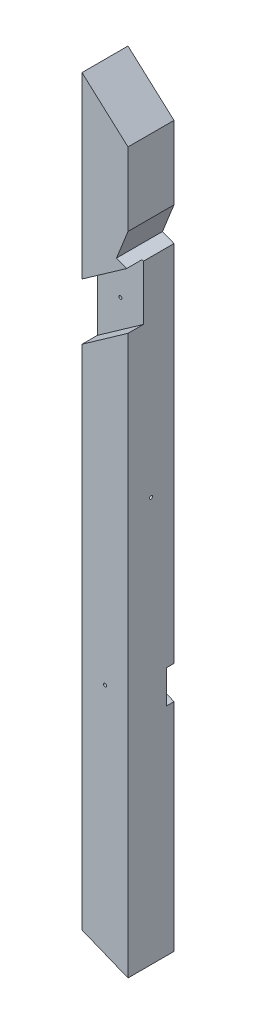
ISO-10303-21;
HEADER;
FILE_DESCRIPTION(('STEP AP214'),'2;1');
FILE_NAME('part.step','',(''),(''),'','','');
FILE_SCHEMA(('AUTOMOTIVE_DESIGN { 1 0 10303 214 1 1 1 1 }'));
ENDSEC;
DATA;
#1=APPLICATION_CONTEXT('core data for automotive mechanical design processes');
#2=APPLICATION_PROTOCOL_DEFINITION('international standard','automotive_design',2000,#1);
#3=PRODUCT_CONTEXT('',#1,'mechanical');
#4=PRODUCT('Part','Part','',(#3));
#5=PRODUCT_RELATED_PRODUCT_CATEGORY('part','',(#4));
#6=PRODUCT_DEFINITION_FORMATION('','',#4);
#7=PRODUCT_DEFINITION_CONTEXT('part definition',#1,'design');
#8=PRODUCT_DEFINITION('design','',#6,#7);
#9=PRODUCT_DEFINITION_SHAPE('','',#8);
#10=(LENGTH_UNIT() NAMED_UNIT(*) SI_UNIT(.MILLI.,.METRE.));
#11=(NAMED_UNIT(*) PLANE_ANGLE_UNIT() SI_UNIT($,.RADIAN.));
#12=(NAMED_UNIT(*) SI_UNIT($,.STERADIAN.) SOLID_ANGLE_UNIT());
#13=UNCERTAINTY_MEASURE_WITH_UNIT(LENGTH_MEASURE(1.E-05),#10,'distance_accuracy_value','');
#14=(GEOMETRIC_REPRESENTATION_CONTEXT(3) GLOBAL_UNCERTAINTY_ASSIGNED_CONTEXT((#13)) GLOBAL_UNIT_ASSIGNED_CONTEXT((#10,
#11,#12)) REPRESENTATION_CONTEXT('',''));
#15=CARTESIAN_POINT('',(0.,0.,0.));
#16=DIRECTION('',(0.,0.,1.));
#17=DIRECTION('',(1.,0.,0.));
#18=AXIS2_PLACEMENT_3D('',#15,#16,#17);
#19=CARTESIAN_POINT('',(-75.,1250.,-75.));
#20=DIRECTION('',(0.,0.,1.));
#21=DIRECTION('',(1.,0.,0.));
#22=AXIS2_PLACEMENT_3D('',#19,#20,#21);
#23=PLANE('',#22);
#24=CARTESIAN_POINT('',(0.,610.,-75.));
#25=DIRECTION('',(0.,0.,1.));
#26=DIRECTION('',(1.,0.,0.));
#27=AXIS2_PLACEMENT_3D('',#24,#25,#26);
#28=CIRCLE('',#27,5.00000000000001);
#29=CARTESIAN_POINT('',(5.00000000000001,610.,-75.));
#30=VERTEX_POINT('',#29);
#31=EDGE_CURVE('E249',#30,#30,#28,.T.);
#32=ORIENTED_EDGE('',*,*,#31,.T.);
#33=EDGE_LOOP('',(#32));
#34=FACE_BOUND('',#33,.T.);
#35=DIRECTION('',(0.,-1.,0.));
#36=VECTOR('',#35,1.);
#37=CARTESIAN_POINT('',(75.,1250.,-75.));
#38=LINE('',#37,#36);
#39=CARTESIAN_POINT('',(75.,749.720866047287,-75.));
#40=VERTEX_POINT('',#39);
#41=CARTESIAN_POINT('',(75.,-436.387143072565,-75.));
#42=VERTEX_POINT('',#41);
#43=EDGE_CURVE('E196',#40,#42,#38,.T.);
#44=ORIENTED_EDGE('',*,*,#43,.T.);
#45=DIRECTION('',(0.927115658058819,-0.37477534148095,0.));
#46=VECTOR('',#45,1.);
#47=CARTESIAN_POINT('',(-75.,-375.751449204717,-75.));
#48=LINE('',#47,#46);
#49=CARTESIAN_POINT('',(-75.,-375.751449204717,-75.));
#50=VERTEX_POINT('',#49);
#51=EDGE_CURVE('E276',#50,#42,#48,.T.);
#52=ORIENTED_EDGE('',*,*,#51,.F.);
#53=DIRECTION('',(0.,-1.,0.));
#54=VECTOR('',#53,1.);
#55=CARTESIAN_POINT('',(-75.,1250.,-75.));
#56=LINE('',#55,#54);
#57=CARTESIAN_POINT('',(-75.,1232.70379713582,-75.));
#58=VERTEX_POINT('',#57);
#59=EDGE_CURVE('E184',#58,#50,#56,.T.);
#60=ORIENTED_EDGE('',*,*,#59,.F.);
#61=DIRECTION('',(0.743023026484703,-0.669265853090917,0.));
#62=VECTOR('',#61,1.);
#63=CARTESIAN_POINT('',(-75.,1232.70379713582,-75.));
#64=LINE('',#63,#62);
#65=CARTESIAN_POINT('',(75.,1097.593747534,-75.));
#66=VERTEX_POINT('',#65);
#67=EDGE_CURVE('E239',#58,#66,#64,.T.);
#68=ORIENTED_EDGE('',*,*,#67,.T.);
#69=CARTESIAN_POINT('',(75.,858.878428234578,-75.));
#70=VERTEX_POINT('',#69);
#71=EDGE_CURVE('E193',#66,#70,#38,.T.);
#72=ORIENTED_EDGE('',*,*,#71,.T.);
#73=DIRECTION('',(-0.370320932699657,-0.928903873823582,0.));
#74=VECTOR('',#73,1.);
#75=CARTESIAN_POINT('',(75.,858.878428234578,-75.));
#76=LINE('',#75,#74);
#77=CARTESIAN_POINT('',(37.5224658519034,764.870707964126,-75.));
#78=VERTEX_POINT('',#77);
#79=EDGE_CURVE('E223',#70,#78,#76,.T.);
#80=ORIENTED_EDGE('',*,*,#79,.T.);
#81=DIRECTION('',(0.927115658058819,-0.37477534148095,0.));
#82=VECTOR('',#81,1.);
#83=CARTESIAN_POINT('',(37.5224658519034,764.870707964126,-75.));
#84=LINE('',#83,#82);
#85=EDGE_CURVE('E227',#78,#40,#84,.T.);
#86=ORIENTED_EDGE('',*,*,#85,.T.);
#87=EDGE_LOOP('',(#44,#52,#60,#68,#72,#80,#86));
#88=FACE_BOUND('',#87,.T.);
#89=ADVANCED_FACE('F50',(#34,#88),#23,.F.);
#90=CARTESIAN_POINT('',(0.,-460.,-75.));
#91=DIRECTION('',(0.,0.,1.));
#92=DIRECTION('',(1.,0.,0.));
#93=AXIS2_PLACEMENT_3D('',#90,#91,#92);
#94=CYLINDRICAL_SURFACE('',#93,5.00000000000001);
#95=CARTESIAN_POINT('',(0.,-460.,75.));
#96=DIRECTION('',(0.,0.,1.));
#97=DIRECTION('',(1.,0.,0.));
#98=AXIS2_PLACEMENT_3D('',#95,#96,#97);
#99=CIRCLE('',#98,5.00000000000001);
#100=CARTESIAN_POINT('',(5.00000000000001,-460.,75.));
#101=VERTEX_POINT('',#100);
#102=EDGE_CURVE('E247',#101,#101,#99,.T.);
#103=ORIENTED_EDGE('',*,*,#102,.T.);
#104=EDGE_LOOP('',(#103));
#105=FACE_BOUND('',#104,.T.);
#106=CARTESIAN_POINT('',(0.,-460.,-50.));
#107=DIRECTION('',(0.,0.,-1.));
#108=DIRECTION('',(-1.,0.,0.));
#109=AXIS2_PLACEMENT_3D('',#106,#107,#108);
#110=CIRCLE('',#109,5.00000000000001);
#111=CARTESIAN_POINT('',(-5.00000000000001,-460.,-50.));
#112=VERTEX_POINT('',#111);
#113=EDGE_CURVE('E54',#112,#112,#110,.F.);
#114=ORIENTED_EDGE('',*,*,#113,.F.);
#115=EDGE_LOOP('',(#114));
#116=FACE_BOUND('',#115,.T.);
#117=ADVANCED_FACE('F346',(#105,#116),#94,.F.);
#118=CARTESIAN_POINT('',(-75.,1250.,75.));
#119=DIRECTION('',(0.,0.,-1.));
#120=DIRECTION('',(-1.,0.,0.));
#121=AXIS2_PLACEMENT_3D('',#118,#119,#120);
#122=PLANE('',#121);
#123=DIRECTION('',(0.,-1.,0.));
#124=VECTOR('',#123,1.);
#125=CARTESIAN_POINT('',(-75.,1250.,75.));
#126=LINE('',#125,#124);
#127=CARTESIAN_POINT('',(-75.,1232.70379713582,75.));
#128=VERTEX_POINT('',#127);
#129=CARTESIAN_POINT('',(-75.,649.486666067746,75.));
#130=VERTEX_POINT('',#129);
#131=EDGE_CURVE('E185',#128,#130,#126,.T.);
#132=ORIENTED_EDGE('',*,*,#131,.T.);
#133=DIRECTION('',(-0.818041595125174,-0.575159063777196,0.));
#134=VECTOR('',#133,1.);
#135=CARTESIAN_POINT('',(74.9999999999999,754.950569224624,75.));
#136=LINE('',#135,#134);
#137=CARTESIAN_POINT('',(70.2771981952262,751.630001810172,75.));
#138=VERTEX_POINT('',#137);
#139=EDGE_CURVE('E293',#138,#130,#136,.T.);
#140=ORIENTED_EDGE('',*,*,#139,.F.);
#141=DIRECTION('',(0.927115658058819,-0.37477534148095,0.));
#142=VECTOR('',#141,1.);
#143=CARTESIAN_POINT('',(37.5224658519034,764.870707964126,75.));
#144=LINE('',#143,#142);
#145=CARTESIAN_POINT('',(37.5224658519034,764.870707964126,75.));
#146=VERTEX_POINT('',#145);
#147=EDGE_CURVE('E217',#146,#138,#144,.T.);
#148=ORIENTED_EDGE('',*,*,#147,.F.);
#149=DIRECTION('',(-0.370320932699657,-0.928903873823582,0.));
#150=VECTOR('',#149,1.);
#151=CARTESIAN_POINT('',(75.,858.878428234578,75.));
#152=LINE('',#151,#150);
#153=CARTESIAN_POINT('',(75.,858.878428234579,75.));
#154=VERTEX_POINT('',#153);
#155=EDGE_CURVE('E224',#154,#146,#152,.T.);
#156=ORIENTED_EDGE('',*,*,#155,.F.);
#157=DIRECTION('',(0.,-1.,0.));
#158=VECTOR('',#157,1.);
#159=CARTESIAN_POINT('',(75.,1250.,75.));
#160=LINE('',#159,#158);
#161=CARTESIAN_POINT('',(75.,1097.593747534,75.));
#162=VERTEX_POINT('',#161);
#163=EDGE_CURVE('E256',#162,#154,#160,.T.);
#164=ORIENTED_EDGE('',*,*,#163,.F.);
#165=DIRECTION('',(0.743023026484703,-0.669265853090917,0.));
#166=VECTOR('',#165,1.);
#167=CARTESIAN_POINT('',(-75.,1232.70379713582,75.));
#168=LINE('',#167,#166);
#169=EDGE_CURVE('E235',#128,#162,#168,.T.);
#170=ORIENTED_EDGE('',*,*,#169,.F.);
#171=EDGE_LOOP('',(#132,#140,#148,#156,#164,#170));
#172=FACE_BOUND('',#171,.T.);
#173=ADVANCED_FACE('F329',(#172),#122,.F.);
#174=CARTESIAN_POINT('',(0.,610.,-75.));
#175=DIRECTION('',(0.,0.,1.));
#176=DIRECTION('',(1.,0.,0.));
#177=AXIS2_PLACEMENT_3D('',#174,#175,#176);
#178=CYLINDRICAL_SURFACE('',#177,5.00000000000001);
#179=ORIENTED_EDGE('',*,*,#31,.F.);
#180=EDGE_LOOP('',(#179));
#181=FACE_BOUND('',#180,.T.);
#182=CARTESIAN_POINT('',(0.,610.,25.));
#183=DIRECTION('',(0.,0.,1.));
#184=DIRECTION('',(1.,0.,0.));
#185=AXIS2_PLACEMENT_3D('',#182,#183,#184);
#186=CIRCLE('',#185,5.00000000000001);
#187=CARTESIAN_POINT('',(5.00000000000001,610.,25.));
#188=VERTEX_POINT('',#187);
#189=EDGE_CURVE('E302',#188,#188,#186,.F.);
#190=ORIENTED_EDGE('',*,*,#189,.F.);
#191=EDGE_LOOP('',(#190));
#192=FACE_BOUND('',#191,.T.);
#193=ADVANCED_FACE('F362',(#181,#192),#178,.F.);
#194=CARTESIAN_POINT('',(75.,1250.,-75.));
#195=DIRECTION('',(-1.,0.,0.));
#196=DIRECTION('',(0.,0.,1.));
#197=AXIS2_PLACEMENT_3D('',#194,#195,#196);
#198=PLANE('',#197);
#199=CARTESIAN_POINT('',(75.,69.9999999999997,0.));
#200=DIRECTION('',(1.,0.,0.));
#201=DIRECTION('',(0.,0.,-1.));
#202=AXIS2_PLACEMENT_3D('',#199,#200,#201);
#203=CIRCLE('',#202,5.00000000000001);
#204=CARTESIAN_POINT('',(75.,69.9999999999997,-5.00000000000001));
#205=VERTEX_POINT('',#204);
#206=EDGE_CURVE('E308',#205,#205,#203,.T.);
#207=ORIENTED_EDGE('',*,*,#206,.F.);
#208=EDGE_LOOP('',(#207));
#209=FACE_BOUND('',#208,.T.);
#210=DIRECTION('',(0.,-1.,0.));
#211=VECTOR('',#210,1.);
#212=CARTESIAN_POINT('',(75.,1250.,-50.));
#213=LINE('',#212,#211);
#214=CARTESIAN_POINT('',(75.,-436.387143072565,-50.));
#215=VERTEX_POINT('',#214);
#216=CARTESIAN_POINT('',(75.,-544.248550795285,-50.));
#217=VERTEX_POINT('',#216);
#218=EDGE_CURVE('E289',#215,#217,#213,.T.);
#219=ORIENTED_EDGE('',*,*,#218,.F.);
#220=DIRECTION('',(0.,0.,-1.));
#221=VECTOR('',#220,1.);
#222=CARTESIAN_POINT('',(75.,-436.387143072565,-50.));
#223=LINE('',#222,#221);
#224=EDGE_CURVE('E283',#215,#42,#223,.T.);
#225=ORIENTED_EDGE('',*,*,#224,.T.);
#226=ORIENTED_EDGE('',*,*,#43,.F.);
#227=DIRECTION('',(0.,0.,1.));
#228=VECTOR('',#227,1.);
#229=CARTESIAN_POINT('',(75.,749.720866047287,-75.));
#230=LINE('',#229,#228);
#231=CARTESIAN_POINT('',(75.,749.720866047287,25.));
#232=VERTEX_POINT('',#231);
#233=EDGE_CURVE('E233',#40,#232,#230,.T.);
#234=ORIENTED_EDGE('',*,*,#233,.T.);
#235=DIRECTION('',(0.,1.,0.));
#236=VECTOR('',#235,1.);
#237=CARTESIAN_POINT('',(75.,571.125839472687,25.));
#238=LINE('',#237,#236);
#239=CARTESIAN_POINT('',(75.,571.125839472687,25.));
#240=VERTEX_POINT('',#239);
#241=EDGE_CURVE('E74',#240,#232,#238,.T.);
#242=ORIENTED_EDGE('',*,*,#241,.F.);
#243=DIRECTION('',(0.,0.,1.));
#244=VECTOR('',#243,1.);
#245=CARTESIAN_POINT('',(75.,571.125839472687,25.));
#246=LINE('',#245,#244);
#247=CARTESIAN_POINT('',(75.,571.125839472687,75.));
#248=VERTEX_POINT('',#247);
#249=EDGE_CURVE('E267',#240,#248,#246,.T.);
#250=ORIENTED_EDGE('',*,*,#249,.T.);
#251=CARTESIAN_POINT('',(75.,-1250.,75.));
#252=VERTEX_POINT('',#251);
#253=EDGE_CURVE('E255',#248,#252,#160,.T.);
#254=ORIENTED_EDGE('',*,*,#253,.T.);
#255=DIRECTION('',(0.,0.,-1.));
#256=VECTOR('',#255,1.);
#257=CARTESIAN_POINT('',(75.,-1250.,-75.));
#258=LINE('',#257,#256);
#259=CARTESIAN_POINT('',(75.,-1250.,-75.));
#260=VERTEX_POINT('',#259);
#261=EDGE_CURVE('E252',#252,#260,#258,.T.);
#262=ORIENTED_EDGE('',*,*,#261,.T.);
#263=CARTESIAN_POINT('',(75.,-544.248550795285,-75.));
#264=VERTEX_POINT('',#263);
#265=EDGE_CURVE('E178',#264,#260,#38,.T.);
#266=ORIENTED_EDGE('',*,*,#265,.F.);
#267=DIRECTION('',(0.,0.,1.));
#268=VECTOR('',#267,1.);
#269=CARTESIAN_POINT('',(75.,-544.248550795285,-75.));
#270=LINE('',#269,#268);
#271=EDGE_CURVE('E291',#264,#217,#270,.T.);
#272=ORIENTED_EDGE('',*,*,#271,.T.);
#273=EDGE_LOOP('',(#219,#225,#226,#234,#242,#250,#254,#262,#266,#272));
#274=FACE_BOUND('',#273,.T.);
#275=ADVANCED_FACE('F266',(#209,#274),#198,.F.);
#276=ORIENTED_EDGE('',*,*,#163,.T.);
#277=DIRECTION('',(0.,0.,1.));
#278=VECTOR('',#277,1.);
#279=CARTESIAN_POINT('',(75.,858.878428234578,-75.));
#280=LINE('',#279,#278);
#281=EDGE_CURVE('E237',#70,#154,#280,.T.);
#282=ORIENTED_EDGE('',*,*,#281,.F.);
#283=ORIENTED_EDGE('',*,*,#71,.F.);
#284=DIRECTION('',(0.,0.,1.));
#285=VECTOR('',#284,1.);
#286=CARTESIAN_POINT('',(75.,1097.593747534,-75.));
#287=LINE('',#286,#285);
#288=EDGE_CURVE('E244',#66,#162,#287,.T.);
#289=ORIENTED_EDGE('',*,*,#288,.T.);
#290=EDGE_LOOP('',(#276,#282,#283,#289));
#291=FACE_BOUND('',#290,.T.);
#292=ADVANCED_FACE('F52',(#291),#198,.F.);
#293=ORIENTED_EDGE('',*,*,#265,.T.);
#294=DIRECTION('',(-0.927115658058818,0.374775341480953,0.));
#295=VECTOR('',#294,1.);
#296=CARTESIAN_POINT('',(-75.,-1189.36430613215,-75.));
#297=LINE('',#296,#295);
#298=CARTESIAN_POINT('',(-75.,-1189.36430613215,-75.));
#299=VERTEX_POINT('',#298);
#300=EDGE_CURVE('E162',#260,#299,#297,.T.);
#301=ORIENTED_EDGE('',*,*,#300,.T.);
#302=CARTESIAN_POINT('',(-75.,-483.612856927437,-75.));
#303=VERTEX_POINT('',#302);
#304=EDGE_CURVE('E176',#303,#299,#56,.T.);
#305=ORIENTED_EDGE('',*,*,#304,.F.);
#306=DIRECTION('',(-0.927115658058819,0.374775341480949,0.));
#307=VECTOR('',#306,1.);
#308=CARTESIAN_POINT('',(78.6083770221287,-545.707193758442,-75.));
#309=LINE('',#308,#307);
#310=EDGE_CURVE('E170',#264,#303,#309,.T.);
#311=ORIENTED_EDGE('',*,*,#310,.F.);
#312=EDGE_LOOP('',(#293,#301,#305,#311));
#313=FACE_BOUND('',#312,.T.);
#314=ADVANCED_FACE('F174',(#313),#23,.F.);
#315=CARTESIAN_POINT('',(-75.,1250.,-75.));
#316=DIRECTION('',(1.,0.,0.));
#317=DIRECTION('',(0.,0.,-1.));
#318=AXIS2_PLACEMENT_3D('',#315,#316,#317);
#319=PLANE('',#318);
#320=ORIENTED_EDGE('',*,*,#304,.T.);
#321=DIRECTION('',(0.,0.,1.));
#322=VECTOR('',#321,1.);
#323=CARTESIAN_POINT('',(-75.,-1189.36430613215,-75.));
#324=LINE('',#323,#322);
#325=CARTESIAN_POINT('',(-75.,-1189.36430613215,75.));
#326=VERTEX_POINT('',#325);
#327=EDGE_CURVE('E159',#299,#326,#324,.T.);
#328=ORIENTED_EDGE('',*,*,#327,.T.);
#329=CARTESIAN_POINT('',(-75.,465.302341614606,75.));
#330=VERTEX_POINT('',#329);
#331=EDGE_CURVE('E189',#330,#326,#126,.T.);
#332=ORIENTED_EDGE('',*,*,#331,.F.);
#333=DIRECTION('',(0.,0.,1.));
#334=VECTOR('',#333,1.);
#335=CARTESIAN_POINT('',(-75.,465.302341614606,25.));
#336=LINE('',#335,#334);
#337=CARTESIAN_POINT('',(-75.,465.302341614606,25.));
#338=VERTEX_POINT('',#337);
#339=EDGE_CURVE('E303',#338,#330,#336,.T.);
#340=ORIENTED_EDGE('',*,*,#339,.F.);
#341=DIRECTION('',(0.,-1.,0.));
#342=VECTOR('',#341,1.);
#343=CARTESIAN_POINT('',(-75.,649.486666067746,25.));
#344=LINE('',#343,#342);
#345=CARTESIAN_POINT('',(-75.,649.486666067746,25.));
#346=VERTEX_POINT('',#345);
#347=EDGE_CURVE('E211',#346,#338,#344,.T.);
#348=ORIENTED_EDGE('',*,*,#347,.F.);
#349=DIRECTION('',(0.,0.,1.));
#350=VECTOR('',#349,1.);
#351=CARTESIAN_POINT('',(-75.,649.486666067746,25.));
#352=LINE('',#351,#350);
#353=EDGE_CURVE('E209',#346,#130,#352,.T.);
#354=ORIENTED_EDGE('',*,*,#353,.T.);
#355=ORIENTED_EDGE('',*,*,#131,.F.);
#356=DIRECTION('',(0.,0.,1.));
#357=VECTOR('',#356,1.);
#358=CARTESIAN_POINT('',(-75.,1232.70379713582,-75.));
#359=LINE('',#358,#357);
#360=EDGE_CURVE('E242',#58,#128,#359,.T.);
#361=ORIENTED_EDGE('',*,*,#360,.F.);
#362=ORIENTED_EDGE('',*,*,#59,.T.);
#363=DIRECTION('',(0.,0.,-1.));
#364=VECTOR('',#363,1.);
#365=CARTESIAN_POINT('',(-75.,-375.751449204717,-50.));
#366=LINE('',#365,#364);
#367=CARTESIAN_POINT('',(-75.,-375.751449204717,-50.));
#368=VERTEX_POINT('',#367);
#369=EDGE_CURVE('E286',#368,#50,#366,.T.);
#370=ORIENTED_EDGE('',*,*,#369,.F.);
#371=DIRECTION('',(0.,1.,0.));
#372=VECTOR('',#371,1.);
#373=CARTESIAN_POINT('',(-75.,-483.612856927437,-50.));
#374=LINE('',#373,#372);
#375=CARTESIAN_POINT('',(-75.,-483.612856927437,-50.));
#376=VERTEX_POINT('',#375);
#377=EDGE_CURVE('E275',#376,#368,#374,.T.);
#378=ORIENTED_EDGE('',*,*,#377,.F.);
#379=DIRECTION('',(0.,0.,-1.));
#380=VECTOR('',#379,1.);
#381=CARTESIAN_POINT('',(-75.,-483.612856927437,-50.));
#382=LINE('',#381,#380);
#383=EDGE_CURVE('E66',#376,#303,#382,.T.);
#384=ORIENTED_EDGE('',*,*,#383,.T.);
#385=EDGE_LOOP('',(#320,#328,#332,#340,#348,#354,#355,#361,#362,#370,#378,#384));
#386=FACE_BOUND('',#385,.T.);
#387=CARTESIAN_POINT('',(-75.,69.9999999999997,0.));
#388=DIRECTION('',(1.,0.,0.));
#389=DIRECTION('',(0.,0.,-1.));
#390=AXIS2_PLACEMENT_3D('',#387,#388,#389);
#391=CIRCLE('',#390,5.00000000000001);
#392=CARTESIAN_POINT('',(-75.,69.9999999999997,-5.00000000000001));
#393=VERTEX_POINT('',#392);
#394=EDGE_CURVE('E229',#393,#393,#391,.T.);
#395=ORIENTED_EDGE('',*,*,#394,.T.);
#396=EDGE_LOOP('',(#395));
#397=FACE_BOUND('',#396,.T.);
#398=ADVANCED_FACE('F181',(#386,#397),#319,.F.);
#399=ORIENTED_EDGE('',*,*,#102,.F.);
#400=EDGE_LOOP('',(#399));
#401=FACE_BOUND('',#400,.T.);
#402=ORIENTED_EDGE('',*,*,#331,.T.);
#403=DIRECTION('',(-0.927115658058818,0.374775341480953,0.));
#404=VECTOR('',#403,1.);
#405=CARTESIAN_POINT('',(-75.,-1189.36430613215,75.));
#406=LINE('',#405,#404);
#407=EDGE_CURVE('E165',#252,#326,#406,.T.);
#408=ORIENTED_EDGE('',*,*,#407,.F.);
#409=ORIENTED_EDGE('',*,*,#253,.F.);
#410=DIRECTION('',(0.81711888506879,0.576469190559163,0.));
#411=VECTOR('',#410,1.);
#412=CARTESIAN_POINT('',(-75.,465.302341614606,75.));
#413=LINE('',#412,#411);
#414=EDGE_CURVE('E212',#330,#248,#413,.T.);
#415=ORIENTED_EDGE('',*,*,#414,.F.);
#416=EDGE_LOOP('',(#402,#408,#409,#415));
#417=FACE_BOUND('',#416,.T.);
#418=ADVANCED_FACE('F270',(#401,#417),#122,.F.);
#419=CARTESIAN_POINT('',(-75.,1232.70379713582,-75.));
#420=DIRECTION('',(-0.669265853090917,-0.743023026484703,0.));
#421=DIRECTION('',(0.743023026484703,-0.669265853090917,0.));
#422=AXIS2_PLACEMENT_3D('',#419,#420,#421);
#423=PLANE('',#422);
#424=ORIENTED_EDGE('',*,*,#169,.T.);
#425=ORIENTED_EDGE('',*,*,#288,.F.);
#426=ORIENTED_EDGE('',*,*,#67,.F.);
#427=ORIENTED_EDGE('',*,*,#360,.T.);
#428=EDGE_LOOP('',(#424,#425,#426,#427));
#429=FACE_BOUND('',#428,.T.);
#430=ADVANCED_FACE('F383',(#429),#423,.F.);
#431=CARTESIAN_POINT('',(37.5224658519034,764.870707964126,-75.));
#432=DIRECTION('',(-0.37477534148095,-0.927115658058819,0.));
#433=DIRECTION('',(0.927115658058819,-0.37477534148095,0.));
#434=AXIS2_PLACEMENT_3D('',#431,#432,#433);
#435=PLANE('',#434);
#436=ORIENTED_EDGE('',*,*,#147,.T.);
#437=DIRECTION('',(0.,0.,-1.));
#438=VECTOR('',#437,1.);
#439=CARTESIAN_POINT('',(70.2771981952263,751.630001810172,-75.));
#440=LINE('',#439,#438);
#441=CARTESIAN_POINT('',(70.2771981952262,751.630001810172,25.));
#442=VERTEX_POINT('',#441);
#443=EDGE_CURVE('E13',#138,#442,#440,.T.);
#444=ORIENTED_EDGE('',*,*,#443,.T.);
#445=DIRECTION('',(-0.927115658058819,0.37477534148095,0.));
#446=VECTOR('',#445,1.);
#447=CARTESIAN_POINT('',(37.5224658519034,764.870707964126,25.));
#448=LINE('',#447,#446);
#449=EDGE_CURVE('E59',#232,#442,#448,.T.);
#450=ORIENTED_EDGE('',*,*,#449,.F.);
#451=ORIENTED_EDGE('',*,*,#233,.F.);
#452=ORIENTED_EDGE('',*,*,#85,.F.);
#453=DIRECTION('',(0.,0.,1.));
#454=VECTOR('',#453,1.);
#455=CARTESIAN_POINT('',(37.5224658519034,764.870707964126,-75.));
#456=LINE('',#455,#454);
#457=EDGE_CURVE('E219',#78,#146,#456,.T.);
#458=ORIENTED_EDGE('',*,*,#457,.T.);
#459=EDGE_LOOP('',(#436,#444,#450,#451,#452,#458));
#460=FACE_BOUND('',#459,.T.);
#461=ADVANCED_FACE('F215',(#460),#435,.F.);
#462=CARTESIAN_POINT('',(75.,858.878428234578,-75.));
#463=DIRECTION('',(-0.928903873823582,0.370320932699656,0.));
#464=DIRECTION('',(-0.370320932699657,-0.928903873823582,0.));
#465=AXIS2_PLACEMENT_3D('',#462,#463,#464);
#466=PLANE('',#465);
#467=ORIENTED_EDGE('',*,*,#155,.T.);
#468=ORIENTED_EDGE('',*,*,#457,.F.);
#469=ORIENTED_EDGE('',*,*,#79,.F.);
#470=ORIENTED_EDGE('',*,*,#281,.T.);
#471=EDGE_LOOP('',(#467,#468,#469,#470));
#472=FACE_BOUND('',#471,.T.);
#473=ADVANCED_FACE('F328',(#472),#466,.F.);
#474=CARTESIAN_POINT('',(-75.,69.9999999999997,0.));
#475=DIRECTION('',(1.,0.,0.));
#476=DIRECTION('',(0.,0.,-1.));
#477=AXIS2_PLACEMENT_3D('',#474,#475,#476);
#478=CYLINDRICAL_SURFACE('',#477,5.00000000000001);
#479=ORIENTED_EDGE('',*,*,#394,.F.);
#480=EDGE_LOOP('',(#479));
#481=FACE_BOUND('',#480,.T.);
#482=ORIENTED_EDGE('',*,*,#206,.T.);
#483=EDGE_LOOP('',(#482));
#484=FACE_BOUND('',#483,.T.);
#485=ADVANCED_FACE('F371',(#481,#484),#478,.F.);
#486=CARTESIAN_POINT('',(74.9999999999999,754.950569224624,25.));
#487=DIRECTION('',(-0.575159063777196,0.818041595125174,0.));
#488=DIRECTION('',(-0.818041595125174,-0.575159063777196,0.));
#489=AXIS2_PLACEMENT_3D('',#486,#487,#488);
#490=PLANE('',#489);
#491=ORIENTED_EDGE('',*,*,#139,.T.);
#492=ORIENTED_EDGE('',*,*,#353,.F.);
#493=DIRECTION('',(-0.818041595125174,-0.575159063777196,0.));
#494=VECTOR('',#493,1.);
#495=CARTESIAN_POINT('',(74.9999999999999,754.950569224624,25.));
#496=LINE('',#495,#494);
#497=EDGE_CURVE('E201',#442,#346,#496,.T.);
#498=ORIENTED_EDGE('',*,*,#497,.F.);
#499=ORIENTED_EDGE('',*,*,#443,.F.);
#500=EDGE_LOOP('',(#491,#492,#498,#499));
#501=FACE_BOUND('',#500,.T.);
#502=ADVANCED_FACE('F206',(#501),#490,.F.);
#503=CARTESIAN_POINT('',(0.,0.,25.));
#504=DIRECTION('',(0.,0.,1.));
#505=DIRECTION('',(1.,0.,0.));
#506=AXIS2_PLACEMENT_3D('',#503,#504,#505);
#507=PLANE('',#506);
#508=ORIENTED_EDGE('',*,*,#449,.T.);
#509=ORIENTED_EDGE('',*,*,#497,.T.);
#510=ORIENTED_EDGE('',*,*,#347,.T.);
#511=DIRECTION('',(0.81711888506879,0.576469190559163,0.));
#512=VECTOR('',#511,1.);
#513=CARTESIAN_POINT('',(-75.,465.302341614606,25.));
#514=LINE('',#513,#512);
#515=EDGE_CURVE('E296',#338,#240,#514,.T.);
#516=ORIENTED_EDGE('',*,*,#515,.T.);
#517=ORIENTED_EDGE('',*,*,#241,.T.);
#518=EDGE_LOOP('',(#508,#509,#510,#516,#517));
#519=FACE_BOUND('',#518,.T.);
#520=ORIENTED_EDGE('',*,*,#189,.T.);
#521=EDGE_LOOP('',(#520));
#522=FACE_BOUND('',#521,.T.);
#523=ADVANCED_FACE('F198',(#519,#522),#507,.T.);
#524=CARTESIAN_POINT('',(-75.,465.302341614606,25.));
#525=DIRECTION('',(0.576469190559163,-0.81711888506879,0.));
#526=DIRECTION('',(0.81711888506879,0.576469190559163,0.));
#527=AXIS2_PLACEMENT_3D('',#524,#525,#526);
#528=PLANE('',#527);
#529=ORIENTED_EDGE('',*,*,#414,.T.);
#530=ORIENTED_EDGE('',*,*,#249,.F.);
#531=ORIENTED_EDGE('',*,*,#515,.F.);
#532=ORIENTED_EDGE('',*,*,#339,.T.);
#533=EDGE_LOOP('',(#529,#530,#531,#532));
#534=FACE_BOUND('',#533,.T.);
#535=ADVANCED_FACE('F334',(#534),#528,.F.);
#536=CARTESIAN_POINT('',(78.6083770221287,-545.707193758442,-50.));
#537=DIRECTION('',(-0.37477534148095,-0.927115658058819,0.));
#538=DIRECTION('',(0.927115658058819,-0.37477534148095,0.));
#539=AXIS2_PLACEMENT_3D('',#536,#537,#538);
#540=PLANE('',#539);
#541=ORIENTED_EDGE('',*,*,#310,.T.);
#542=ORIENTED_EDGE('',*,*,#383,.F.);
#543=DIRECTION('',(-0.927115658058819,0.374775341480949,0.));
#544=VECTOR('',#543,1.);
#545=CARTESIAN_POINT('',(78.6083770221287,-545.707193758442,-50.));
#546=LINE('',#545,#544);
#547=EDGE_CURVE('E273',#217,#376,#546,.T.);
#548=ORIENTED_EDGE('',*,*,#547,.F.);
#549=ORIENTED_EDGE('',*,*,#271,.F.);
#550=EDGE_LOOP('',(#541,#542,#548,#549));
#551=FACE_BOUND('',#550,.T.);
#552=ADVANCED_FACE('F336',(#551),#540,.F.);
#553=CARTESIAN_POINT('',(0.,0.,-50.));
#554=DIRECTION('',(0.,0.,-1.));
#555=DIRECTION('',(-1.,0.,0.));
#556=AXIS2_PLACEMENT_3D('',#553,#554,#555);
#557=PLANE('',#556);
#558=ORIENTED_EDGE('',*,*,#113,.T.);
#559=EDGE_LOOP('',(#558));
#560=FACE_BOUND('',#559,.T.);
#561=ORIENTED_EDGE('',*,*,#218,.T.);
#562=ORIENTED_EDGE('',*,*,#547,.T.);
#563=ORIENTED_EDGE('',*,*,#377,.T.);
#564=DIRECTION('',(0.927115658058819,-0.37477534148095,0.));
#565=VECTOR('',#564,1.);
#566=CARTESIAN_POINT('',(-75.,-375.751449204717,-50.));
#567=LINE('',#566,#565);
#568=EDGE_CURVE('E278',#368,#215,#567,.T.);
#569=ORIENTED_EDGE('',*,*,#568,.T.);
#570=EDGE_LOOP('',(#561,#562,#563,#569));
#571=FACE_BOUND('',#570,.T.);
#572=ADVANCED_FACE('F322',(#560,#571),#557,.T.);
#573=CARTESIAN_POINT('',(-75.,-375.751449204717,-50.));
#574=DIRECTION('',(0.37477534148095,0.927115658058819,0.));
#575=DIRECTION('',(-0.927115658058819,0.37477534148095,0.));
#576=AXIS2_PLACEMENT_3D('',#573,#574,#575);
#577=PLANE('',#576);
#578=ORIENTED_EDGE('',*,*,#51,.T.);
#579=ORIENTED_EDGE('',*,*,#224,.F.);
#580=ORIENTED_EDGE('',*,*,#568,.F.);
#581=ORIENTED_EDGE('',*,*,#369,.T.);
#582=EDGE_LOOP('',(#578,#579,#580,#581));
#583=FACE_BOUND('',#582,.T.);
#584=ADVANCED_FACE('F319',(#583),#577,.F.);
#585=CARTESIAN_POINT('',(-75.,-1189.36430613215,-75.));
#586=DIRECTION('',(0.374775341480953,0.927115658058818,0.));
#587=DIRECTION('',(-0.927115658058818,0.374775341480953,0.));
#588=AXIS2_PLACEMENT_3D('',#585,#586,#587);
#589=PLANE('',#588);
#590=ORIENTED_EDGE('',*,*,#407,.T.);
#591=ORIENTED_EDGE('',*,*,#327,.F.);
#592=ORIENTED_EDGE('',*,*,#300,.F.);
#593=ORIENTED_EDGE('',*,*,#261,.F.);
#594=EDGE_LOOP('',(#590,#591,#592,#593));
#595=FACE_BOUND('',#594,.T.);
#596=ADVANCED_FACE('F161',(#595),#589,.F.);
#597=CLOSED_SHELL('',(#89,#117,#173,#193,#275,#292,#314,#398,#418,#430,#461,#473,#485,#502,#523,
#535,#552,#572,#584,#596));
#598=MANIFOLD_SOLID_BREP('B2',#597);
#599=ADVANCED_BREP_SHAPE_REPRESENTATION('',(#18,#598),#14);
#600=SHAPE_DEFINITION_REPRESENTATION(#9,#599);
ENDSEC;
END-ISO-10303-21;
